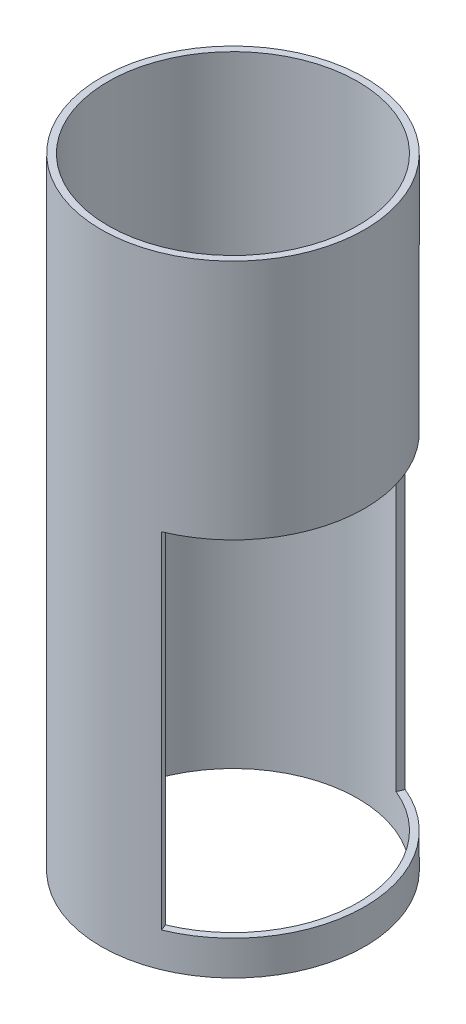
ISO-10303-21;
HEADER;
FILE_DESCRIPTION(('STEP AP214'),'2;1');
FILE_NAME('part.step','',(''),(''),'','','');
FILE_SCHEMA(('AUTOMOTIVE_DESIGN { 1 0 10303 214 1 1 1 1 }'));
ENDSEC;
DATA;
#1=APPLICATION_CONTEXT('core data for automotive mechanical design processes');
#2=APPLICATION_PROTOCOL_DEFINITION('international standard','automotive_design',2000,#1);
#3=PRODUCT_CONTEXT('',#1,'mechanical');
#4=PRODUCT('Part','Part','',(#3));
#5=PRODUCT_RELATED_PRODUCT_CATEGORY('part','',(#4));
#6=PRODUCT_DEFINITION_FORMATION('','',#4);
#7=PRODUCT_DEFINITION_CONTEXT('part definition',#1,'design');
#8=PRODUCT_DEFINITION('design','',#6,#7);
#9=PRODUCT_DEFINITION_SHAPE('','',#8);
#10=(LENGTH_UNIT() NAMED_UNIT(*) SI_UNIT(.MILLI.,.METRE.));
#11=(NAMED_UNIT(*) PLANE_ANGLE_UNIT() SI_UNIT($,.RADIAN.));
#12=(NAMED_UNIT(*) SI_UNIT($,.STERADIAN.) SOLID_ANGLE_UNIT());
#13=UNCERTAINTY_MEASURE_WITH_UNIT(LENGTH_MEASURE(1.E-05),#10,'distance_accuracy_value','');
#14=(GEOMETRIC_REPRESENTATION_CONTEXT(3) GLOBAL_UNCERTAINTY_ASSIGNED_CONTEXT((#13)) GLOBAL_UNIT_ASSIGNED_CONTEXT((#10,
#11,#12)) REPRESENTATION_CONTEXT('',''));
#15=CARTESIAN_POINT('',(0.,0.,0.));
#16=DIRECTION('',(0.,0.,1.));
#17=DIRECTION('',(1.,0.,0.));
#18=AXIS2_PLACEMENT_3D('',#15,#16,#17);
#19=CARTESIAN_POINT('',(0.,180.,0.));
#20=DIRECTION('',(0.,-1.,0.));
#21=DIRECTION('',(0.,0.,-1.));
#22=AXIS2_PLACEMENT_3D('',#19,#20,#21);
#23=CYLINDRICAL_SURFACE('',#22,38.2);
#24=CARTESIAN_POINT('',(0.,0.,0.));
#25=DIRECTION('',(0.,1.,0.));
#26=DIRECTION('',(0.,0.,1.));
#27=AXIS2_PLACEMENT_3D('',#24,#25,#26);
#28=CIRCLE('',#27,38.2);
#29=CARTESIAN_POINT('',(0.,0.,38.2));
#30=VERTEX_POINT('',#29);
#31=EDGE_CURVE('E101',#30,#30,#28,.T.);
#32=ORIENTED_EDGE('',*,*,#31,.T.);
#33=EDGE_LOOP('',(#32));
#34=FACE_BOUND('',#33,.T.);
#35=CARTESIAN_POINT('',(0.,180.,0.));
#36=DIRECTION('',(0.,1.,0.));
#37=DIRECTION('',(0.,0.,1.));
#38=AXIS2_PLACEMENT_3D('',#35,#36,#37);
#39=CIRCLE('',#38,38.2);
#40=CARTESIAN_POINT('',(0.,180.,38.2));
#41=VERTEX_POINT('',#40);
#42=EDGE_CURVE('E104',#41,#41,#39,.T.);
#43=ORIENTED_EDGE('',*,*,#42,.F.);
#44=EDGE_LOOP('',(#43));
#45=FACE_BOUND('',#44,.T.);
#46=CARTESIAN_POINT('',(0.,10.,0.));
#47=DIRECTION('',(0.,1.,0.));
#48=DIRECTION('',(0.,0.,1.));
#49=AXIS2_PLACEMENT_3D('',#46,#47,#48);
#50=CIRCLE('',#49,38.2);
#51=CARTESIAN_POINT('',(14.6185071163464,10.,35.2921981419312));
#52=VERTEX_POINT('',#51);
#53=CARTESIAN_POINT('',(14.6185071163463,10.,-35.2921981419312));
#54=VERTEX_POINT('',#53);
#55=EDGE_CURVE('E88',#52,#54,#50,.T.);
#56=ORIENTED_EDGE('',*,*,#55,.F.);
#57=DIRECTION('',(0.,-1.,0.));
#58=VECTOR('',#57,1.);
#59=CARTESIAN_POINT('',(14.6185071163464,190.258314203311,35.2921981419312));
#60=LINE('',#59,#58);
#61=CARTESIAN_POINT('',(14.6185071163464,110.,35.2921981419312));
#62=VERTEX_POINT('',#61);
#63=EDGE_CURVE('E76',#62,#52,#60,.T.);
#64=ORIENTED_EDGE('',*,*,#63,.F.);
#65=CARTESIAN_POINT('',(0.,110.,0.));
#66=DIRECTION('',(0.,1.,0.));
#67=DIRECTION('',(0.,0.,1.));
#68=AXIS2_PLACEMENT_3D('',#65,#66,#67);
#69=CIRCLE('',#68,38.2);
#70=CARTESIAN_POINT('',(14.6185071163463,110.,-35.2921981419312));
#71=VERTEX_POINT('',#70);
#72=EDGE_CURVE('E80',#62,#71,#69,.T.);
#73=ORIENTED_EDGE('',*,*,#72,.T.);
#74=DIRECTION('',(0.,-1.,0.));
#75=VECTOR('',#74,1.);
#76=CARTESIAN_POINT('',(14.6185071163463,190.258314203311,-35.2921981419312));
#77=LINE('',#76,#75);
#78=EDGE_CURVE('E91',#71,#54,#77,.T.);
#79=ORIENTED_EDGE('',*,*,#78,.T.);
#80=EDGE_LOOP('',(#56,#64,#73,#79));
#81=FACE_BOUND('',#80,.T.);
#82=ADVANCED_FACE('F35',(#34,#45,#81),#23,.T.);
#83=CARTESIAN_POINT('',(0.,180.,0.));
#84=DIRECTION('',(0.,-1.,0.));
#85=DIRECTION('',(0.,0.,-1.));
#86=AXIS2_PLACEMENT_3D('',#83,#84,#85);
#87=CYLINDRICAL_SURFACE('',#86,36.2);
#88=CARTESIAN_POINT('',(0.,180.,0.));
#89=DIRECTION('',(0.,1.,0.));
#90=DIRECTION('',(0.,0.,1.));
#91=AXIS2_PLACEMENT_3D('',#88,#89,#90);
#92=CIRCLE('',#91,36.2);
#93=CARTESIAN_POINT('',(0.,180.,36.2));
#94=VERTEX_POINT('',#93);
#95=EDGE_CURVE('E98',#94,#94,#92,.T.);
#96=ORIENTED_EDGE('',*,*,#95,.T.);
#97=EDGE_LOOP('',(#96));
#98=FACE_BOUND('',#97,.T.);
#99=CARTESIAN_POINT('',(0.,0.,0.));
#100=DIRECTION('',(0.,1.,0.));
#101=DIRECTION('',(0.,0.,1.));
#102=AXIS2_PLACEMENT_3D('',#99,#100,#101);
#103=CIRCLE('',#102,36.2);
#104=CARTESIAN_POINT('',(0.,0.,36.2));
#105=VERTEX_POINT('',#104);
#106=EDGE_CURVE('E86',#105,#105,#103,.T.);
#107=ORIENTED_EDGE('',*,*,#106,.F.);
#108=EDGE_LOOP('',(#107));
#109=FACE_BOUND('',#108,.T.);
#110=DIRECTION('',(0.,-1.,0.));
#111=VECTOR('',#110,1.);
#112=CARTESIAN_POINT('',(13.8531402516162,180.,33.4444390769086));
#113=LINE('',#112,#111);
#114=CARTESIAN_POINT('',(13.8531402516162,110.,33.4444390769086));
#115=VERTEX_POINT('',#114);
#116=CARTESIAN_POINT('',(13.8531402516162,10.,33.4444390769086));
#117=VERTEX_POINT('',#116);
#118=EDGE_CURVE('E42',#115,#117,#113,.T.);
#119=ORIENTED_EDGE('',*,*,#118,.T.);
#120=CARTESIAN_POINT('',(0.,10.,0.));
#121=DIRECTION('',(0.,1.,0.));
#122=DIRECTION('',(0.,0.,1.));
#123=AXIS2_PLACEMENT_3D('',#120,#121,#122);
#124=CIRCLE('',#123,36.2);
#125=CARTESIAN_POINT('',(13.8531402516161,10.,-33.4444390769086));
#126=VERTEX_POINT('',#125);
#127=EDGE_CURVE('E11',#117,#126,#124,.T.);
#128=ORIENTED_EDGE('',*,*,#127,.T.);
#129=DIRECTION('',(0.,-1.,0.));
#130=VECTOR('',#129,1.);
#131=CARTESIAN_POINT('',(13.8531402516161,180.,-33.4444390769086));
#132=LINE('',#131,#130);
#133=CARTESIAN_POINT('',(13.8531402516161,110.,-33.4444390769086));
#134=VERTEX_POINT('',#133);
#135=EDGE_CURVE('E111',#126,#134,#132,.F.);
#136=ORIENTED_EDGE('',*,*,#135,.T.);
#137=CARTESIAN_POINT('',(0.,110.,0.));
#138=DIRECTION('',(0.,1.,0.));
#139=DIRECTION('',(0.,0.,1.));
#140=AXIS2_PLACEMENT_3D('',#137,#138,#139);
#141=CIRCLE('',#140,36.2);
#142=EDGE_CURVE('E107',#115,#134,#141,.T.);
#143=ORIENTED_EDGE('',*,*,#142,.F.);
#144=EDGE_LOOP('',(#119,#128,#136,#143));
#145=FACE_BOUND('',#144,.T.);
#146=ADVANCED_FACE('F114',(#98,#109,#145),#87,.F.);
#147=CARTESIAN_POINT('',(0.,180.,0.));
#148=DIRECTION('',(0.,1.,0.));
#149=DIRECTION('',(0.,0.,1.));
#150=AXIS2_PLACEMENT_3D('',#147,#148,#149);
#151=PLANE('',#150);
#152=ORIENTED_EDGE('',*,*,#95,.F.);
#153=EDGE_LOOP('',(#152));
#154=FACE_BOUND('',#153,.T.);
#155=ORIENTED_EDGE('',*,*,#42,.T.);
#156=EDGE_LOOP('',(#155));
#157=FACE_BOUND('',#156,.T.);
#158=ADVANCED_FACE('F135',(#154,#157),#151,.T.);
#159=CARTESIAN_POINT('',(0.,0.,0.));
#160=DIRECTION('',(0.,1.,0.));
#161=DIRECTION('',(0.,0.,1.));
#162=AXIS2_PLACEMENT_3D('',#159,#160,#161);
#163=PLANE('',#162);
#164=ORIENTED_EDGE('',*,*,#106,.T.);
#165=EDGE_LOOP('',(#164));
#166=FACE_BOUND('',#165,.T.);
#167=ORIENTED_EDGE('',*,*,#31,.F.);
#168=EDGE_LOOP('',(#167));
#169=FACE_BOUND('',#168,.T.);
#170=ADVANCED_FACE('F143',(#166,#169),#163,.F.);
#171=CARTESIAN_POINT('',(0.,190.258314203311,0.));
#172=DIRECTION('',(0.923879532511288,0.,-0.382683432365088));
#173=DIRECTION('',(-0.382683432365088,0.,-0.923879532511288));
#174=AXIS2_PLACEMENT_3D('',#171,#172,#173);
#175=PLANE('',#174);
#176=DIRECTION('',(0.382683432365088,0.,0.923879532511288));
#177=VECTOR('',#176,1.);
#178=CARTESIAN_POINT('',(0.,110.,0.));
#179=LINE('',#178,#177);
#180=EDGE_CURVE('E54',#115,#62,#179,.T.);
#181=ORIENTED_EDGE('',*,*,#180,.T.);
#182=ORIENTED_EDGE('',*,*,#63,.T.);
#183=DIRECTION('',(0.382683432365088,0.,0.923879532511288));
#184=VECTOR('',#183,1.);
#185=CARTESIAN_POINT('',(0.,10.,0.));
#186=LINE('',#185,#184);
#187=EDGE_CURVE('E89',#117,#52,#186,.T.);
#188=ORIENTED_EDGE('',*,*,#187,.F.);
#189=ORIENTED_EDGE('',*,*,#118,.F.);
#190=EDGE_LOOP('',(#181,#182,#188,#189));
#191=FACE_BOUND('',#190,.T.);
#192=ADVANCED_FACE('F73',(#191),#175,.T.);
#193=CARTESIAN_POINT('',(0.,190.258314203311,0.));
#194=DIRECTION('',(0.923879532511288,0.,0.382683432365087));
#195=DIRECTION('',(0.382683432365087,0.,-0.923879532511288));
#196=AXIS2_PLACEMENT_3D('',#193,#194,#195);
#197=PLANE('',#196);
#198=DIRECTION('',(-0.382683432365087,0.,0.923879532511288));
#199=VECTOR('',#198,1.);
#200=CARTESIAN_POINT('',(0.,10.,0.));
#201=LINE('',#200,#199);
#202=EDGE_CURVE('E97',#54,#126,#201,.T.);
#203=ORIENTED_EDGE('',*,*,#202,.F.);
#204=ORIENTED_EDGE('',*,*,#78,.F.);
#205=DIRECTION('',(-0.382683432365087,0.,0.923879532511288));
#206=VECTOR('',#205,1.);
#207=CARTESIAN_POINT('',(0.,110.,0.));
#208=LINE('',#207,#206);
#209=EDGE_CURVE('E49',#71,#134,#208,.T.);
#210=ORIENTED_EDGE('',*,*,#209,.T.);
#211=ORIENTED_EDGE('',*,*,#135,.F.);
#212=EDGE_LOOP('',(#203,#204,#210,#211));
#213=FACE_BOUND('',#212,.T.);
#214=ADVANCED_FACE('F117',(#213),#197,.T.);
#215=CARTESIAN_POINT('',(0.,10.,0.));
#216=DIRECTION('',(0.,1.,0.));
#217=DIRECTION('',(0.,0.,1.));
#218=AXIS2_PLACEMENT_3D('',#215,#216,#217);
#219=PLANE('',#218);
#220=ORIENTED_EDGE('',*,*,#187,.T.);
#221=ORIENTED_EDGE('',*,*,#55,.T.);
#222=ORIENTED_EDGE('',*,*,#202,.T.);
#223=ORIENTED_EDGE('',*,*,#127,.F.);
#224=EDGE_LOOP('',(#220,#221,#222,#223));
#225=FACE_BOUND('',#224,.T.);
#226=ADVANCED_FACE('F121',(#225),#219,.T.);
#227=CARTESIAN_POINT('',(0.,110.,0.));
#228=DIRECTION('',(0.,1.,0.));
#229=DIRECTION('',(0.,0.,1.));
#230=AXIS2_PLACEMENT_3D('',#227,#228,#229);
#231=PLANE('',#230);
#232=ORIENTED_EDGE('',*,*,#142,.T.);
#233=ORIENTED_EDGE('',*,*,#209,.F.);
#234=ORIENTED_EDGE('',*,*,#72,.F.);
#235=ORIENTED_EDGE('',*,*,#180,.F.);
#236=EDGE_LOOP('',(#232,#233,#234,#235));
#237=FACE_BOUND('',#236,.T.);
#238=ADVANCED_FACE('F83',(#237),#231,.F.);
#239=CLOSED_SHELL('',(#82,#146,#158,#170,#192,#214,#226,#238));
#240=MANIFOLD_SOLID_BREP('B2',#239);
#241=ADVANCED_BREP_SHAPE_REPRESENTATION('',(#18,#240),#14);
#242=SHAPE_DEFINITION_REPRESENTATION(#9,#241);
ENDSEC;
END-ISO-10303-21;
